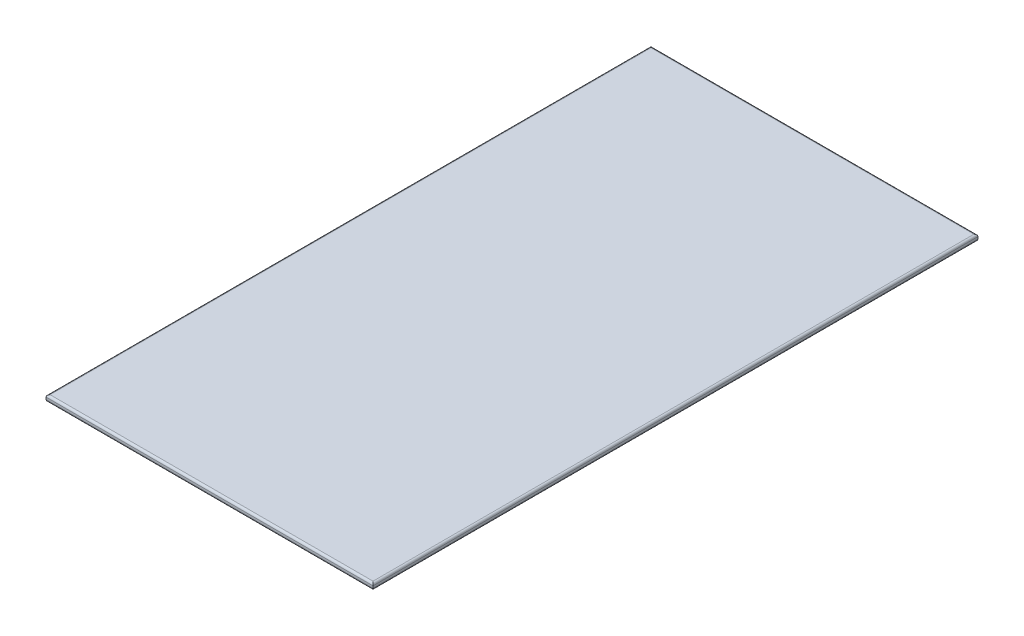
ISO-10303-21;
HEADER;
FILE_DESCRIPTION(('STEP AP214'),'2;1');
FILE_NAME('part.step','',(''),(''),'','','');
FILE_SCHEMA(('AUTOMOTIVE_DESIGN { 1 0 10303 214 1 1 1 1 }'));
ENDSEC;
DATA;
#1=APPLICATION_CONTEXT('core data for automotive mechanical design processes');
#2=APPLICATION_PROTOCOL_DEFINITION('international standard','automotive_design',2000,#1);
#3=PRODUCT_CONTEXT('',#1,'mechanical');
#4=PRODUCT('Part','Part','',(#3));
#5=PRODUCT_RELATED_PRODUCT_CATEGORY('part','',(#4));
#6=PRODUCT_DEFINITION_FORMATION('','',#4);
#7=PRODUCT_DEFINITION_CONTEXT('part definition',#1,'design');
#8=PRODUCT_DEFINITION('design','',#6,#7);
#9=PRODUCT_DEFINITION_SHAPE('','',#8);
#10=(LENGTH_UNIT() NAMED_UNIT(*) SI_UNIT(.MILLI.,.METRE.));
#11=(NAMED_UNIT(*) PLANE_ANGLE_UNIT() SI_UNIT($,.RADIAN.));
#12=(NAMED_UNIT(*) SI_UNIT($,.STERADIAN.) SOLID_ANGLE_UNIT());
#13=UNCERTAINTY_MEASURE_WITH_UNIT(LENGTH_MEASURE(1.E-05),#10,'distance_accuracy_value','');
#14=(GEOMETRIC_REPRESENTATION_CONTEXT(3) GLOBAL_UNCERTAINTY_ASSIGNED_CONTEXT((#13)) GLOBAL_UNIT_ASSIGNED_CONTEXT((#10,
#11,#12)) REPRESENTATION_CONTEXT('',''));
#15=CARTESIAN_POINT('',(0.,0.,0.));
#16=DIRECTION('',(0.,0.,1.));
#17=DIRECTION('',(1.,0.,0.));
#18=AXIS2_PLACEMENT_3D('',#15,#16,#17);
#19=CARTESIAN_POINT('',(80.,2.99999999999999,-148.));
#20=DIRECTION('',(-1.,0.,0.));
#21=DIRECTION('',(0.,0.,1.));
#22=AXIS2_PLACEMENT_3D('',#19,#20,#21);
#23=PLANE('',#22);
#24=DIRECTION('',(0.,-1.,0.));
#25=VECTOR('',#24,1.);
#26=CARTESIAN_POINT('',(80.,2.99999999999999,148.));
#27=LINE('',#26,#25);
#28=CARTESIAN_POINT('',(80.,1.99999999999999,148.));
#29=VERTEX_POINT('',#28);
#30=CARTESIAN_POINT('',(80.,1.,148.));
#31=VERTEX_POINT('',#30);
#32=EDGE_CURVE('E142',#29,#31,#27,.T.);
#33=ORIENTED_EDGE('',*,*,#32,.T.);
#34=DIRECTION('',(0.,0.,-1.));
#35=VECTOR('',#34,1.);
#36=CARTESIAN_POINT('',(80.,1.,-148.));
#37=LINE('',#36,#35);
#38=CARTESIAN_POINT('',(80.,1.,-148.));
#39=VERTEX_POINT('',#38);
#40=EDGE_CURVE('E151',#31,#39,#37,.T.);
#41=ORIENTED_EDGE('',*,*,#40,.T.);
#42=DIRECTION('',(0.,-1.,0.));
#43=VECTOR('',#42,1.);
#44=CARTESIAN_POINT('',(80.,2.99999999999999,-148.));
#45=LINE('',#44,#43);
#46=CARTESIAN_POINT('',(80.,1.99999999999999,-148.));
#47=VERTEX_POINT('',#46);
#48=EDGE_CURVE('E120',#47,#39,#45,.T.);
#49=ORIENTED_EDGE('',*,*,#48,.F.);
#50=DIRECTION('',(0.,0.,-1.));
#51=VECTOR('',#50,1.);
#52=CARTESIAN_POINT('',(80.,1.99999999999999,148.));
#53=LINE('',#52,#51);
#54=EDGE_CURVE('E153',#47,#29,#53,.F.);
#55=ORIENTED_EDGE('',*,*,#54,.T.);
#56=EDGE_LOOP('',(#33,#41,#49,#55));
#57=FACE_BOUND('',#56,.T.);
#58=ADVANCED_FACE('F33',(#57),#23,.F.);
#59=CARTESIAN_POINT('',(-80.,2.99999999999999,-148.));
#60=DIRECTION('',(0.,0.,1.));
#61=DIRECTION('',(1.,0.,0.));
#62=AXIS2_PLACEMENT_3D('',#59,#60,#61);
#63=PLANE('',#62);
#64=ORIENTED_EDGE('',*,*,#48,.T.);
#65=DIRECTION('',(-1.,0.,0.));
#66=VECTOR('',#65,1.);
#67=CARTESIAN_POINT('',(-80.,1.,-148.));
#68=LINE('',#67,#66);
#69=CARTESIAN_POINT('',(-80.,1.,-148.));
#70=VERTEX_POINT('',#69);
#71=EDGE_CURVE('E119',#39,#70,#68,.T.);
#72=ORIENTED_EDGE('',*,*,#71,.T.);
#73=DIRECTION('',(0.,-1.,0.));
#74=VECTOR('',#73,1.);
#75=CARTESIAN_POINT('',(-80.,2.99999999999999,-148.));
#76=LINE('',#75,#74);
#77=CARTESIAN_POINT('',(-80.,1.99999999999999,-148.));
#78=VERTEX_POINT('',#77);
#79=EDGE_CURVE('E102',#78,#70,#76,.T.);
#80=ORIENTED_EDGE('',*,*,#79,.F.);
#81=DIRECTION('',(-1.,0.,0.));
#82=VECTOR('',#81,1.);
#83=CARTESIAN_POINT('',(80.,1.99999999999999,-148.));
#84=LINE('',#83,#82);
#85=EDGE_CURVE('E116',#78,#47,#84,.F.);
#86=ORIENTED_EDGE('',*,*,#85,.T.);
#87=EDGE_LOOP('',(#64,#72,#80,#86));
#88=FACE_BOUND('',#87,.T.);
#89=ADVANCED_FACE('F115',(#88),#63,.F.);
#90=CARTESIAN_POINT('',(-80.,2.99999999999999,-148.));
#91=DIRECTION('',(1.,0.,0.));
#92=DIRECTION('',(0.,0.,-1.));
#93=AXIS2_PLACEMENT_3D('',#90,#91,#92);
#94=PLANE('',#93);
#95=ORIENTED_EDGE('',*,*,#79,.T.);
#96=DIRECTION('',(0.,0.,1.));
#97=VECTOR('',#96,1.);
#98=CARTESIAN_POINT('',(-80.,1.,-148.));
#99=LINE('',#98,#97);
#100=CARTESIAN_POINT('',(-80.,1.,148.));
#101=VERTEX_POINT('',#100);
#102=EDGE_CURVE('E108',#70,#101,#99,.T.);
#103=ORIENTED_EDGE('',*,*,#102,.T.);
#104=DIRECTION('',(0.,-1.,0.));
#105=VECTOR('',#104,1.);
#106=CARTESIAN_POINT('',(-80.,2.99999999999999,148.));
#107=LINE('',#106,#105);
#108=CARTESIAN_POINT('',(-80.,1.99999999999999,148.));
#109=VERTEX_POINT('',#108);
#110=EDGE_CURVE('E104',#109,#101,#107,.T.);
#111=ORIENTED_EDGE('',*,*,#110,.F.);
#112=DIRECTION('',(0.,0.,1.));
#113=VECTOR('',#112,1.);
#114=CARTESIAN_POINT('',(-80.,1.99999999999999,-148.));
#115=LINE('',#114,#113);
#116=EDGE_CURVE('E99',#109,#78,#115,.F.);
#117=ORIENTED_EDGE('',*,*,#116,.T.);
#118=EDGE_LOOP('',(#95,#103,#111,#117));
#119=FACE_BOUND('',#118,.T.);
#120=ADVANCED_FACE('F101',(#119),#94,.F.);
#121=CARTESIAN_POINT('',(-80.,2.99999999999999,148.));
#122=DIRECTION('',(0.,0.,-1.));
#123=DIRECTION('',(-1.,0.,0.));
#124=AXIS2_PLACEMENT_3D('',#121,#122,#123);
#125=PLANE('',#124);
#126=ORIENTED_EDGE('',*,*,#110,.T.);
#127=DIRECTION('',(1.,0.,0.));
#128=VECTOR('',#127,1.);
#129=CARTESIAN_POINT('',(-80.,1.,148.));
#130=LINE('',#129,#128);
#131=EDGE_CURVE('E155',#101,#31,#130,.T.);
#132=ORIENTED_EDGE('',*,*,#131,.T.);
#133=ORIENTED_EDGE('',*,*,#32,.F.);
#134=DIRECTION('',(1.,0.,0.));
#135=VECTOR('',#134,1.);
#136=CARTESIAN_POINT('',(-80.,1.99999999999999,148.));
#137=LINE('',#136,#135);
#138=EDGE_CURVE('E157',#29,#109,#137,.F.);
#139=ORIENTED_EDGE('',*,*,#138,.T.);
#140=EDGE_LOOP('',(#126,#132,#133,#139));
#141=FACE_BOUND('',#140,.T.);
#142=ADVANCED_FACE('F195',(#141),#125,.F.);
#143=CARTESIAN_POINT('',(0.,2.99999999999999,0.));
#144=DIRECTION('',(0.,1.,0.));
#145=DIRECTION('',(0.,0.,1.));
#146=AXIS2_PLACEMENT_3D('',#143,#144,#145);
#147=PLANE('',#146);
#148=DIRECTION('',(0.,0.,1.));
#149=VECTOR('',#148,1.);
#150=CARTESIAN_POINT('',(-79.,2.99999999999999,148.));
#151=LINE('',#150,#149);
#152=CARTESIAN_POINT('',(-79.,2.99999999999999,-147.));
#153=VERTEX_POINT('',#152);
#154=CARTESIAN_POINT('',(-79.,2.99999999999999,147.));
#155=VERTEX_POINT('',#154);
#156=EDGE_CURVE('E42',#153,#155,#151,.T.);
#157=ORIENTED_EDGE('',*,*,#156,.T.);
#158=DIRECTION('',(1.,0.,0.));
#159=VECTOR('',#158,1.);
#160=CARTESIAN_POINT('',(80.,2.99999999999999,147.));
#161=LINE('',#160,#159);
#162=CARTESIAN_POINT('',(79.,2.99999999999999,147.));
#163=VERTEX_POINT('',#162);
#164=EDGE_CURVE('E11',#155,#163,#161,.T.);
#165=ORIENTED_EDGE('',*,*,#164,.T.);
#166=DIRECTION('',(0.,0.,-1.));
#167=VECTOR('',#166,1.);
#168=CARTESIAN_POINT('',(79.,2.99999999999999,-148.));
#169=LINE('',#168,#167);
#170=CARTESIAN_POINT('',(79.,2.99999999999999,-147.));
#171=VERTEX_POINT('',#170);
#172=EDGE_CURVE('E149',#163,#171,#169,.T.);
#173=ORIENTED_EDGE('',*,*,#172,.T.);
#174=DIRECTION('',(-1.,0.,0.));
#175=VECTOR('',#174,1.);
#176=CARTESIAN_POINT('',(-80.,2.99999999999999,-147.));
#177=LINE('',#176,#175);
#178=EDGE_CURVE('E53',#171,#153,#177,.T.);
#179=ORIENTED_EDGE('',*,*,#178,.T.);
#180=EDGE_LOOP('',(#157,#165,#173,#179));
#181=FACE_BOUND('',#180,.T.);
#182=ADVANCED_FACE('F201',(#181),#147,.T.);
#183=CARTESIAN_POINT('',(0.,0.,0.));
#184=DIRECTION('',(0.,1.,0.));
#185=DIRECTION('',(0.,0.,1.));
#186=AXIS2_PLACEMENT_3D('',#183,#184,#185);
#187=PLANE('',#186);
#188=DIRECTION('',(0.,0.,1.));
#189=VECTOR('',#188,1.);
#190=CARTESIAN_POINT('',(-79.,0.,0.));
#191=LINE('',#190,#189);
#192=CARTESIAN_POINT('',(-79.,0.,147.));
#193=VERTEX_POINT('',#192);
#194=CARTESIAN_POINT('',(-79.,0.,-147.));
#195=VERTEX_POINT('',#194);
#196=EDGE_CURVE('E162',#193,#195,#191,.F.);
#197=ORIENTED_EDGE('',*,*,#196,.T.);
#198=DIRECTION('',(-1.,0.,0.));
#199=VECTOR('',#198,1.);
#200=CARTESIAN_POINT('',(0.,0.,-147.));
#201=LINE('',#200,#199);
#202=CARTESIAN_POINT('',(79.,0.,-147.));
#203=VERTEX_POINT('',#202);
#204=EDGE_CURVE('E109',#195,#203,#201,.F.);
#205=ORIENTED_EDGE('',*,*,#204,.T.);
#206=DIRECTION('',(0.,0.,-1.));
#207=VECTOR('',#206,1.);
#208=CARTESIAN_POINT('',(79.,0.,0.));
#209=LINE('',#208,#207);
#210=CARTESIAN_POINT('',(79.,0.,147.));
#211=VERTEX_POINT('',#210);
#212=EDGE_CURVE('E166',#203,#211,#209,.F.);
#213=ORIENTED_EDGE('',*,*,#212,.T.);
#214=DIRECTION('',(1.,0.,0.));
#215=VECTOR('',#214,1.);
#216=CARTESIAN_POINT('',(0.,0.,147.));
#217=LINE('',#216,#215);
#218=EDGE_CURVE('E164',#211,#193,#217,.F.);
#219=ORIENTED_EDGE('',*,*,#218,.T.);
#220=EDGE_LOOP('',(#197,#205,#213,#219));
#221=FACE_BOUND('',#220,.T.);
#222=ADVANCED_FACE('F203',(#221),#187,.F.);
#223=CARTESIAN_POINT('',(-80.,1.,147.));
#224=DIRECTION('',(1.,0.,0.));
#225=DIRECTION('',(0.,0.,-1.));
#226=AXIS2_PLACEMENT_3D('',#223,#224,#225);
#227=CYLINDRICAL_SURFACE('',#226,1.);
#228=CARTESIAN_POINT('',(-79.,1.,147.));
#229=DIRECTION('',(0.707106781186548,0.,0.707106781186547));
#230=DIRECTION('',(0.707106781186547,0.,-0.707106781186548));
#231=AXIS2_PLACEMENT_3D('',#228,#229,#230);
#232=ELLIPSE('',#231,1.41421356237309,1.);
#233=EDGE_CURVE('E143',#193,#101,#232,.F.);
#234=ORIENTED_EDGE('',*,*,#233,.F.);
#235=ORIENTED_EDGE('',*,*,#218,.F.);
#236=CARTESIAN_POINT('',(79.,1.,147.));
#237=DIRECTION('',(0.707106781186547,0.,-0.707106781186548));
#238=DIRECTION('',(-0.707106781186547,0.,-0.707106781186547));
#239=AXIS2_PLACEMENT_3D('',#236,#237,#238);
#240=ELLIPSE('',#239,1.4142135623731,1.);
#241=EDGE_CURVE('E139',#31,#211,#240,.T.);
#242=ORIENTED_EDGE('',*,*,#241,.F.);
#243=ORIENTED_EDGE('',*,*,#131,.F.);
#244=EDGE_LOOP('',(#234,#235,#242,#243));
#245=FACE_BOUND('',#244,.T.);
#246=ADVANCED_FACE('F182',(#245),#227,.T.);
#247=CARTESIAN_POINT('',(79.,1.,-148.));
#248=DIRECTION('',(0.,0.,-1.));
#249=DIRECTION('',(-1.,0.,0.));
#250=AXIS2_PLACEMENT_3D('',#247,#248,#249);
#251=CYLINDRICAL_SURFACE('',#250,1.);
#252=ORIENTED_EDGE('',*,*,#241,.T.);
#253=ORIENTED_EDGE('',*,*,#212,.F.);
#254=CARTESIAN_POINT('',(79.,1.,-147.));
#255=DIRECTION('',(-0.707106781186547,0.,-0.707106781186547));
#256=DIRECTION('',(0.707106781186547,0.,-0.707106781186548));
#257=AXIS2_PLACEMENT_3D('',#254,#255,#256);
#258=ELLIPSE('',#257,1.41421356237309,1.);
#259=EDGE_CURVE('E130',#39,#203,#258,.T.);
#260=ORIENTED_EDGE('',*,*,#259,.F.);
#261=ORIENTED_EDGE('',*,*,#40,.F.);
#262=EDGE_LOOP('',(#252,#253,#260,#261));
#263=FACE_BOUND('',#262,.T.);
#264=ADVANCED_FACE('F186',(#263),#251,.T.);
#265=CARTESIAN_POINT('',(-79.,1.,-148.));
#266=DIRECTION('',(0.,0.,1.));
#267=DIRECTION('',(1.,0.,0.));
#268=AXIS2_PLACEMENT_3D('',#265,#266,#267);
#269=CYLINDRICAL_SURFACE('',#268,1.);
#270=ORIENTED_EDGE('',*,*,#233,.T.);
#271=ORIENTED_EDGE('',*,*,#102,.F.);
#272=CARTESIAN_POINT('',(-79.,1.,-147.));
#273=DIRECTION('',(-0.707106781186547,0.,0.707106781186548));
#274=DIRECTION('',(0.707106781186548,0.,0.707106781186547));
#275=AXIS2_PLACEMENT_3D('',#272,#273,#274);
#276=ELLIPSE('',#275,1.4142135623731,1.);
#277=EDGE_CURVE('E129',#195,#70,#276,.F.);
#278=ORIENTED_EDGE('',*,*,#277,.F.);
#279=ORIENTED_EDGE('',*,*,#196,.F.);
#280=EDGE_LOOP('',(#270,#271,#278,#279));
#281=FACE_BOUND('',#280,.T.);
#282=ADVANCED_FACE('F194',(#281),#269,.T.);
#283=CARTESIAN_POINT('',(-80.,1.,-147.));
#284=DIRECTION('',(-1.,0.,0.));
#285=DIRECTION('',(0.,0.,1.));
#286=AXIS2_PLACEMENT_3D('',#283,#284,#285);
#287=CYLINDRICAL_SURFACE('',#286,1.);
#288=ORIENTED_EDGE('',*,*,#259,.T.);
#289=ORIENTED_EDGE('',*,*,#204,.F.);
#290=ORIENTED_EDGE('',*,*,#277,.T.);
#291=ORIENTED_EDGE('',*,*,#71,.F.);
#292=EDGE_LOOP('',(#288,#289,#290,#291));
#293=FACE_BOUND('',#292,.T.);
#294=ADVANCED_FACE('F189',(#293),#287,.T.);
#295=CARTESIAN_POINT('',(0.,1.99999999999999,-147.));
#296=DIRECTION('',(1.,0.,0.));
#297=DIRECTION('',(0.,0.,-1.));
#298=AXIS2_PLACEMENT_3D('',#295,#296,#297);
#299=CYLINDRICAL_SURFACE('',#298,1.);
#300=CARTESIAN_POINT('',(79.,1.99999999999999,-147.));
#301=DIRECTION('',(0.707106781186547,0.,0.707106781186547));
#302=DIRECTION('',(-0.707106781186547,0.,0.707106781186548));
#303=AXIS2_PLACEMENT_3D('',#300,#301,#302);
#304=ELLIPSE('',#303,1.41421356237309,1.);
#305=EDGE_CURVE('E125',#47,#171,#304,.T.);
#306=ORIENTED_EDGE('',*,*,#305,.F.);
#307=ORIENTED_EDGE('',*,*,#85,.F.);
#308=CARTESIAN_POINT('',(-79.,1.99999999999999,-147.));
#309=DIRECTION('',(0.707106781186547,0.,-0.707106781186548));
#310=DIRECTION('',(0.707106781186548,0.,0.707106781186547));
#311=AXIS2_PLACEMENT_3D('',#308,#309,#310);
#312=ELLIPSE('',#311,1.4142135623731,1.);
#313=EDGE_CURVE('E37',#153,#78,#312,.F.);
#314=ORIENTED_EDGE('',*,*,#313,.F.);
#315=ORIENTED_EDGE('',*,*,#178,.F.);
#316=EDGE_LOOP('',(#306,#307,#314,#315));
#317=FACE_BOUND('',#316,.T.);
#318=ADVANCED_FACE('F35',(#317),#299,.T.);
#319=CARTESIAN_POINT('',(-79.,1.99999999999999,0.));
#320=DIRECTION('',(0.,0.,-1.));
#321=DIRECTION('',(-1.,0.,0.));
#322=AXIS2_PLACEMENT_3D('',#319,#320,#321);
#323=CYLINDRICAL_SURFACE('',#322,1.);
#324=ORIENTED_EDGE('',*,*,#313,.T.);
#325=ORIENTED_EDGE('',*,*,#116,.F.);
#326=CARTESIAN_POINT('',(-79.,1.99999999999999,147.));
#327=DIRECTION('',(-0.707106781186548,0.,-0.707106781186547));
#328=DIRECTION('',(0.707106781186547,0.,-0.707106781186548));
#329=AXIS2_PLACEMENT_3D('',#326,#327,#328);
#330=ELLIPSE('',#329,1.41421356237309,1.);
#331=EDGE_CURVE('E132',#155,#109,#330,.F.);
#332=ORIENTED_EDGE('',*,*,#331,.F.);
#333=ORIENTED_EDGE('',*,*,#156,.F.);
#334=EDGE_LOOP('',(#324,#325,#332,#333));
#335=FACE_BOUND('',#334,.T.);
#336=ADVANCED_FACE('F128',(#335),#323,.T.);
#337=CARTESIAN_POINT('',(79.,1.99999999999999,0.));
#338=DIRECTION('',(0.,0.,1.));
#339=DIRECTION('',(1.,0.,0.));
#340=AXIS2_PLACEMENT_3D('',#337,#338,#339);
#341=CYLINDRICAL_SURFACE('',#340,1.);
#342=ORIENTED_EDGE('',*,*,#305,.T.);
#343=ORIENTED_EDGE('',*,*,#172,.F.);
#344=CARTESIAN_POINT('',(79.,1.99999999999999,147.));
#345=DIRECTION('',(-0.707106781186547,0.,0.707106781186548));
#346=DIRECTION('',(0.707106781186547,0.,0.707106781186547));
#347=AXIS2_PLACEMENT_3D('',#344,#345,#346);
#348=ELLIPSE('',#347,1.4142135623731,1.);
#349=EDGE_CURVE('E135',#29,#163,#348,.T.);
#350=ORIENTED_EDGE('',*,*,#349,.F.);
#351=ORIENTED_EDGE('',*,*,#54,.F.);
#352=EDGE_LOOP('',(#342,#343,#350,#351));
#353=FACE_BOUND('',#352,.T.);
#354=ADVANCED_FACE('F200',(#353),#341,.T.);
#355=CARTESIAN_POINT('',(0.,1.99999999999999,147.));
#356=DIRECTION('',(-1.,0.,0.));
#357=DIRECTION('',(0.,0.,1.));
#358=AXIS2_PLACEMENT_3D('',#355,#356,#357);
#359=CYLINDRICAL_SURFACE('',#358,1.);
#360=ORIENTED_EDGE('',*,*,#331,.T.);
#361=ORIENTED_EDGE('',*,*,#138,.F.);
#362=ORIENTED_EDGE('',*,*,#349,.T.);
#363=ORIENTED_EDGE('',*,*,#164,.F.);
#364=EDGE_LOOP('',(#360,#361,#362,#363));
#365=FACE_BOUND('',#364,.T.);
#366=ADVANCED_FACE('F198',(#365),#359,.T.);
#367=CLOSED_SHELL('',(#58,#89,#120,#142,#182,#222,#246,#264,#282,#294,#318,#336,#354,#366));
#368=MANIFOLD_SOLID_BREP('B2',#367);
#369=ADVANCED_BREP_SHAPE_REPRESENTATION('',(#18,#368),#14);
#370=SHAPE_DEFINITION_REPRESENTATION(#9,#369);
ENDSEC;
END-ISO-10303-21;
